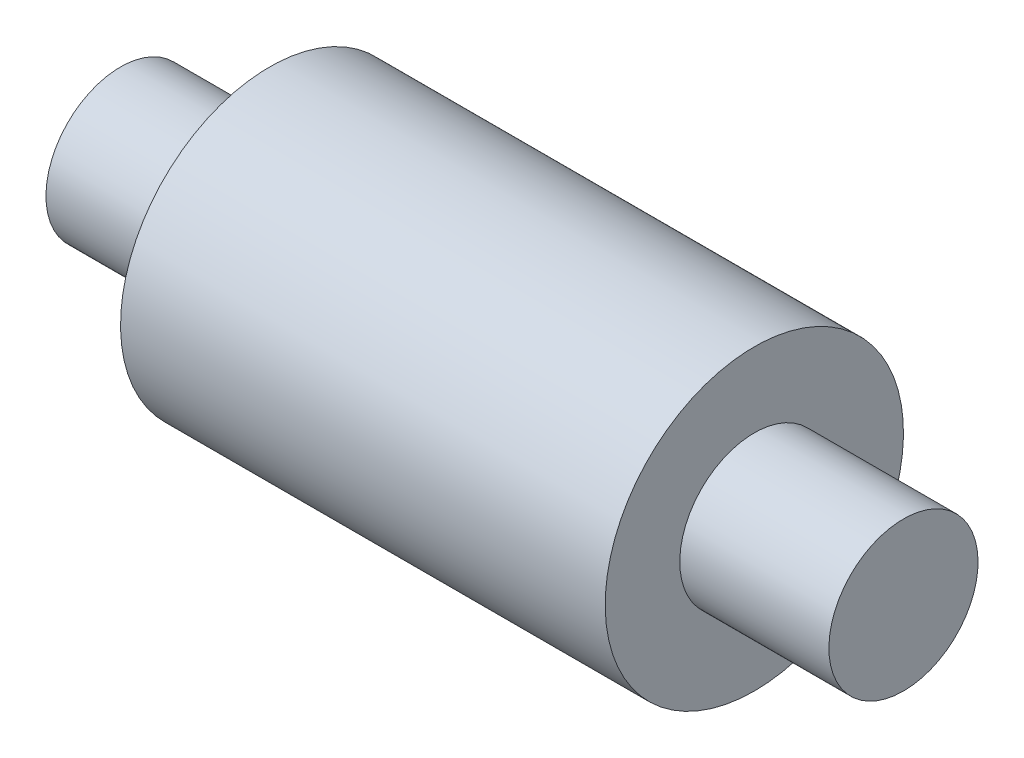
ISO-10303-21;
HEADER;
FILE_DESCRIPTION(('STEP AP214'),'2;1');
FILE_NAME('part.step','',(''),(''),'','','');
FILE_SCHEMA(('AUTOMOTIVE_DESIGN { 1 0 10303 214 1 1 1 1 }'));
ENDSEC;
DATA;
#1=APPLICATION_CONTEXT('core data for automotive mechanical design processes');
#2=APPLICATION_PROTOCOL_DEFINITION('international standard','automotive_design',2000,#1);
#3=PRODUCT_CONTEXT('',#1,'mechanical');
#4=PRODUCT('Part','Part','',(#3));
#5=PRODUCT_RELATED_PRODUCT_CATEGORY('part','',(#4));
#6=PRODUCT_DEFINITION_FORMATION('','',#4);
#7=PRODUCT_DEFINITION_CONTEXT('part definition',#1,'design');
#8=PRODUCT_DEFINITION('design','',#6,#7);
#9=PRODUCT_DEFINITION_SHAPE('','',#8);
#10=(LENGTH_UNIT() NAMED_UNIT(*) SI_UNIT(.MILLI.,.METRE.));
#11=(NAMED_UNIT(*) PLANE_ANGLE_UNIT() SI_UNIT($,.RADIAN.));
#12=(NAMED_UNIT(*) SI_UNIT($,.STERADIAN.) SOLID_ANGLE_UNIT());
#13=UNCERTAINTY_MEASURE_WITH_UNIT(LENGTH_MEASURE(1.E-05),#10,'distance_accuracy_value','');
#14=(GEOMETRIC_REPRESENTATION_CONTEXT(3) GLOBAL_UNCERTAINTY_ASSIGNED_CONTEXT((#13)) GLOBAL_UNIT_ASSIGNED_CONTEXT((#10,
#11,#12)) REPRESENTATION_CONTEXT('',''));
#15=CARTESIAN_POINT('',(0.,0.,0.));
#16=DIRECTION('',(0.,0.,1.));
#17=DIRECTION('',(1.,0.,0.));
#18=AXIS2_PLACEMENT_3D('',#15,#16,#17);
#19=CARTESIAN_POINT('',(21.,0.,0.));
#20=DIRECTION('',(1.,0.,0.));
#21=DIRECTION('',(0.,1.,0.));
#22=AXIS2_PLACEMENT_3D('',#19,#20,#21);
#23=PLANE('',#22);
#24=CARTESIAN_POINT('',(21.,0.,0.));
#25=DIRECTION('',(-1.,0.,0.));
#26=DIRECTION('',(0.,-1.,0.));
#27=AXIS2_PLACEMENT_3D('',#24,#25,#26);
#28=CIRCLE('',#27,2.);
#29=CARTESIAN_POINT('',(21.,-2.,0.));
#30=VERTEX_POINT('',#29);
#31=EDGE_CURVE('E13',#30,#30,#28,.T.);
#32=ORIENTED_EDGE('',*,*,#31,.F.);
#33=EDGE_LOOP('',(#32));
#34=FACE_BOUND('',#33,.T.);
#35=ADVANCED_FACE('F57',(#34),#23,.T.);
#36=CARTESIAN_POINT('',(-16.7017543859649,0.,0.));
#37=DIRECTION('',(-1.,0.,0.));
#38=DIRECTION('',(0.,-1.,0.));
#39=AXIS2_PLACEMENT_3D('',#36,#37,#38);
#40=CYLINDRICAL_SURFACE('',#39,2.);
#41=ORIENTED_EDGE('',*,*,#31,.T.);
#42=EDGE_LOOP('',(#41));
#43=FACE_BOUND('',#42,.T.);
#44=CARTESIAN_POINT('',(17.,0.,0.));
#45=DIRECTION('',(-1.,0.,0.));
#46=DIRECTION('',(0.,-1.,0.));
#47=AXIS2_PLACEMENT_3D('',#44,#45,#46);
#48=CIRCLE('',#47,2.);
#49=CARTESIAN_POINT('',(17.,-2.,0.));
#50=VERTEX_POINT('',#49);
#51=EDGE_CURVE('E69',#50,#50,#48,.T.);
#52=ORIENTED_EDGE('',*,*,#51,.F.);
#53=EDGE_LOOP('',(#52));
#54=FACE_BOUND('',#53,.T.);
#55=ADVANCED_FACE('F127',(#43,#54),#40,.T.);
#56=CARTESIAN_POINT('',(17.,0.,0.));
#57=DIRECTION('',(1.,0.,0.));
#58=DIRECTION('',(0.,1.,0.));
#59=AXIS2_PLACEMENT_3D('',#56,#57,#58);
#60=PLANE('',#59);
#61=ORIENTED_EDGE('',*,*,#51,.T.);
#62=EDGE_LOOP('',(#61));
#63=FACE_BOUND('',#62,.T.);
#64=CARTESIAN_POINT('',(17.,0.,0.));
#65=DIRECTION('',(-1.,0.,0.));
#66=DIRECTION('',(0.,-1.,0.));
#67=AXIS2_PLACEMENT_3D('',#64,#65,#66);
#68=CIRCLE('',#67,4.);
#69=CARTESIAN_POINT('',(17.,-4.,0.));
#70=VERTEX_POINT('',#69);
#71=EDGE_CURVE('E73',#70,#70,#68,.T.);
#72=ORIENTED_EDGE('',*,*,#71,.F.);
#73=EDGE_LOOP('',(#72));
#74=FACE_BOUND('',#73,.T.);
#75=ADVANCED_FACE('F100',(#63,#74),#60,.T.);
#76=CARTESIAN_POINT('',(-16.7017543859649,0.,0.));
#77=DIRECTION('',(-1.,0.,0.));
#78=DIRECTION('',(0.,-1.,0.));
#79=AXIS2_PLACEMENT_3D('',#76,#77,#78);
#80=CYLINDRICAL_SURFACE('',#79,4.);
#81=CARTESIAN_POINT('',(11.5,-4.,0.));
#82=CARTESIAN_POINT('',(11.4999984495079,-3.99999906578675,0.0552507257798208));
#83=CARTESIAN_POINT('',(11.4954056328175,-3.99884385421219,0.110518771887176));
#84=CARTESIAN_POINT('',(11.477183232462,-3.99434742553261,0.219470882513688));
#85=CARTESIAN_POINT('',(11.4635485269748,-3.99100496946646,0.273154031247159));
#86=CARTESIAN_POINT('',(11.4277071643586,-3.98250417554693,0.377347248121718));
#87=CARTESIAN_POINT('',(11.4055108008565,-3.97734801894725,0.42786104228667));
#88=CARTESIAN_POINT('',(11.3532124066368,-3.96576895871729,0.524448087936285));
#89=CARTESIAN_POINT('',(11.323110109254,-3.95934601236034,0.57052118956584));
#90=CARTESIAN_POINT('',(11.2551994735639,-3.94578275727868,0.657867951533947));
#91=CARTESIAN_POINT('',(11.2172589500272,-3.93863138099022,0.699037126707382));
#92=CARTESIAN_POINT('',(11.1350318633941,-3.92449080078353,0.774499284802204));
#93=CARTESIAN_POINT('',(11.0907445847023,-3.91750161525566,0.808791491299424));
#94=CARTESIAN_POINT('',(10.9962698488417,-3.9043651713314,0.870017695199356));
#95=CARTESIAN_POINT('',(10.9460045127931,-3.89823196313737,0.896834810616906));
#96=CARTESIAN_POINT('',(10.8415010588944,-3.88766329874815,0.941597939033686));
#97=CARTESIAN_POINT('',(10.7872635777828,-3.88322757115192,0.95954537029289));
#98=CARTESIAN_POINT('',(10.6775043345317,-3.87666984478367,0.985703224536195));
#99=CARTESIAN_POINT('',(10.6220300693001,-3.87450327383617,0.994101512222227));
#100=CARTESIAN_POINT('',(10.5104209539907,-3.8725957502516,1.00150785004524));
#101=CARTESIAN_POINT('',(10.4542862128676,-3.87285440299096,1.00051742787865));
#102=CARTESIAN_POINT('',(10.3443894615037,-3.87572803664412,0.989324349759522));
#103=CARTESIAN_POINT('',(10.2906029190233,-3.87828575334586,0.979345560127015));
#104=CARTESIAN_POINT('',(10.1854926327258,-3.88537806450989,0.950816124602073));
#105=CARTESIAN_POINT('',(10.1341690646473,-3.88991279980464,0.932264868046284));
#106=CARTESIAN_POINT('',(10.0348413224986,-3.90050075936124,0.886926318624771));
#107=CARTESIAN_POINT('',(9.98687588547363,-3.90656884979614,0.860057778155275));
#108=CARTESIAN_POINT('',(9.89605419349544,-3.91953140564257,0.79890418400997));
#109=CARTESIAN_POINT('',(9.85319883462183,-3.9264260155649,0.764617832539227));
#110=CARTESIAN_POINT('',(9.7725309228704,-3.94050587026521,0.688442283120812));
#111=CARTESIAN_POINT('',(9.73489700662576,-3.94769379651981,0.646364172110574));
#112=CARTESIAN_POINT('',(9.6671858383574,-3.96137310385857,0.556407945002467));
#113=CARTESIAN_POINT('',(9.63710881715762,-3.96786446366277,0.508529651805297));
#114=CARTESIAN_POINT('',(9.58529960918374,-3.97945154729455,0.408077259120929));
#115=CARTESIAN_POINT('',(9.56359643983038,-3.9845424008515,0.355487595472417));
#116=CARTESIAN_POINT('',(9.52938846286028,-3.99271944660946,0.247250672095256));
#117=CARTESIAN_POINT('',(9.51688189572124,-3.99580602226187,0.191603999433657));
#118=CARTESIAN_POINT('',(9.50169495629411,-3.9995699951425,0.0803599802600184));
#119=CARTESIAN_POINT('',(9.4987713159498,-4.00030702338852,0.0247978133254736));
#120=CARTESIAN_POINT('',(9.50216600137032,-3.999458698763,-0.0860219165343387));
#121=CARTESIAN_POINT('',(9.50848349519942,-3.99787355494564,-0.14127950642973));
#122=CARTESIAN_POINT('',(9.52998060559425,-3.99259720751571,-0.249076179184328));
#123=CARTESIAN_POINT('',(9.54502750898466,-3.98893756123874,-0.301643412645837));
#124=CARTESIAN_POINT('',(9.58340472268563,-3.97992471089423,-0.403504861635008));
#125=CARTESIAN_POINT('',(9.60673586954211,-3.97457133579928,-0.452798746021757));
#126=CARTESIAN_POINT('',(9.66149075258315,-3.96262205284207,-0.547682089619899));
#127=CARTESIAN_POINT('',(9.69305074159784,-3.95600578244621,-0.593190294557222));
#128=CARTESIAN_POINT('',(9.76319327253131,-3.94229672791613,-0.678351075762166));
#129=CARTESIAN_POINT('',(9.80177702641127,-3.93520386167803,-0.71800263931534));
#130=CARTESIAN_POINT('',(9.88600130722964,-3.92112637973847,-0.791327045381821));
#131=CARTESIAN_POINT('',(9.93179180200161,-3.91414869458187,-0.824829245081356));
#132=CARTESIAN_POINT('',(10.0284884229771,-3.90128585584826,-0.8836738393418));
#133=CARTESIAN_POINT('',(10.0793943219732,-3.89540065378017,-0.909016596105292));
#134=CARTESIAN_POINT('',(10.1846038149421,-3.88545396489777,-0.950634280406196));
#135=CARTESIAN_POINT('',(10.2388850855627,-3.88138170194604,-0.966962931102711));
#136=CARTESIAN_POINT('',(10.3495397585927,-3.87551162726789,-0.990230439969187));
#137=CARTESIAN_POINT('',(10.4059127006883,-3.87371331813291,-0.99717135165244));
#138=CARTESIAN_POINT('',(10.5174140159035,-3.87263267469304,-1.00135906022266));
#139=CARTESIAN_POINT('',(10.5725316234165,-3.87327955152176,-0.99887859852008));
#140=CARTESIAN_POINT('',(10.6815359257787,-3.87685272671895,-0.984918185541913));
#141=CARTESIAN_POINT('',(10.7354226453424,-3.87977897927904,-0.973438415124514));
#142=CARTESIAN_POINT('',(10.8401389727103,-3.88754173788482,-0.941954212961864));
#143=CARTESIAN_POINT('',(10.8909848701601,-3.89236676824206,-0.922000936453585));
#144=CARTESIAN_POINT('',(10.9886435884758,-3.90338503816552,-0.874176609070048));
#145=CARTESIAN_POINT('',(11.0354558487913,-3.90957846747182,-0.846304460022794));
#146=CARTESIAN_POINT('',(11.1250364193347,-3.92283756175675,-0.782578499091425));
#147=CARTESIAN_POINT('',(11.1676673822826,-3.92992176554505,-0.746535441941504));
#148=CARTESIAN_POINT('',(11.2463646965303,-3.94405351497524,-0.667859580793158));
#149=CARTESIAN_POINT('',(11.282429486742,-3.95110105151373,-0.625225214174098));
#150=CARTESIAN_POINT('',(11.3476075390431,-3.96451770431775,-0.533645057801728));
#151=CARTESIAN_POINT('',(11.3765830757811,-3.97087222243912,-0.484598948210926));
#152=CARTESIAN_POINT('',(11.4258316419604,-3.98203283316746,-0.382177373006985));
#153=CARTESIAN_POINT('',(11.446110907099,-3.98684003466521,-0.328805042291161));
#154=CARTESIAN_POINT('',(11.4743812202198,-3.99365373043694,-0.229606835495649));
#155=CARTESIAN_POINT('',(11.483967495369,-3.9960172336846,-0.184253447272047));
#156=CARTESIAN_POINT('',(11.496777295748,-3.99919070154632,-0.092604047690856));
#157=CARTESIAN_POINT('',(11.5000012995369,-4.00000078300596,-0.0463081074950778));
#158=CARTESIAN_POINT('',(11.5,-4.,0.));
#159=B_SPLINE_CURVE_WITH_KNOTS('',3,(#81,#82,#83,#84,#85,#86,#87,#88,#89,#90,#91,#92,#93,#94,
#95,#96,#97,#98,#99,#100,#101,#102,#103,#104,#105,#106,#107,#108,#109,#110,#111,#112,#113,#114,
#115,#116,#117,#118,#119,#120,#121,#122,#123,#124,#125,#126,#127,#128,#129,#130,#131,#132,#133,
#134,#135,#136,#137,#138,#139,#140,#141,#142,#143,#144,#145,#146,#147,#148,#149,#150,#151,#152,
#153,#154,#155,#156,#157,#158),.UNSPECIFIED.,.T.,.F.,(4,2,2,2,2,2,2,2,2,2,2,2,2,2,2,2,2,2,2,2,2,
2,2,2,2,2,2,2,2,2,2,2,2,2,2,2,2,2,4),(0.,0.16558247498126,0.331258825175933,0.496736601524071,
0.662219960112886,0.830762902914261,0.999324863867081,1.17039098363871,1.34142974112912,
1.50904196732954,1.67662692075131,1.84014998004679,2.00368468977359,2.16887018582586,
2.33408460557442,2.50401000646013,2.67394059705498,2.84445486006076,3.01493649125762,
3.18105539299518,3.34715934075162,3.51080183009359,3.67446084881527,3.84102391710235,
4.0076157533868,4.17829672802984,4.34897012499673,4.51861503076025,4.68822282168272,
4.85295853599076,5.0176909397069,5.18144267039632,5.34521712091268,5.51326384273274,
5.68135046513613,5.85248123666393,6.02348909214234,6.16228161961434,6.30106370695361),.UNSPECIFIED.);
#160=CARTESIAN_POINT('',(11.5,-4.,0.));
#161=VERTEX_POINT('',#160);
#162=EDGE_CURVE('E60',#161,#161,#159,.T.);
#163=ORIENTED_EDGE('',*,*,#162,.F.);
#164=EDGE_LOOP('',(#163));
#165=FACE_BOUND('',#164,.T.);
#166=ORIENTED_EDGE('',*,*,#71,.T.);
#167=EDGE_LOOP('',(#166));
#168=FACE_BOUND('',#167,.T.);
#169=CARTESIAN_POINT('',(4.,0.,0.));
#170=DIRECTION('',(-1.,0.,0.));
#171=DIRECTION('',(0.,-1.,0.));
#172=AXIS2_PLACEMENT_3D('',#169,#170,#171);
#173=CIRCLE('',#172,4.);
#174=CARTESIAN_POINT('',(4.,-4.,0.));
#175=VERTEX_POINT('',#174);
#176=EDGE_CURVE('E78',#175,#175,#173,.T.);
#177=ORIENTED_EDGE('',*,*,#176,.F.);
#178=EDGE_LOOP('',(#177));
#179=FACE_BOUND('',#178,.T.);
#180=ADVANCED_FACE('F96',(#165,#168,#179),#80,.T.);
#181=CARTESIAN_POINT('',(4.,0.,0.));
#182=DIRECTION('',(-1.,0.,0.));
#183=DIRECTION('',(0.,-1.,0.));
#184=AXIS2_PLACEMENT_3D('',#181,#182,#183);
#185=PLANE('',#184);
#186=ORIENTED_EDGE('',*,*,#176,.T.);
#187=EDGE_LOOP('',(#186));
#188=FACE_BOUND('',#187,.T.);
#189=CARTESIAN_POINT('',(4.,0.,0.));
#190=DIRECTION('',(-1.,0.,0.));
#191=DIRECTION('',(0.,-1.,0.));
#192=AXIS2_PLACEMENT_3D('',#189,#190,#191);
#193=CIRCLE('',#192,2.);
#194=CARTESIAN_POINT('',(4.,-2.,0.));
#195=VERTEX_POINT('',#194);
#196=EDGE_CURVE('E81',#195,#195,#193,.T.);
#197=ORIENTED_EDGE('',*,*,#196,.F.);
#198=EDGE_LOOP('',(#197));
#199=FACE_BOUND('',#198,.T.);
#200=ADVANCED_FACE('F99',(#188,#199),#185,.T.);
#201=CARTESIAN_POINT('',(-16.7017543859649,0.,0.));
#202=DIRECTION('',(-1.,0.,0.));
#203=DIRECTION('',(0.,-1.,0.));
#204=AXIS2_PLACEMENT_3D('',#201,#202,#203);
#205=CYLINDRICAL_SURFACE('',#204,2.);
#206=ORIENTED_EDGE('',*,*,#196,.T.);
#207=EDGE_LOOP('',(#206));
#208=FACE_BOUND('',#207,.T.);
#209=CARTESIAN_POINT('',(0.,0.,0.));
#210=DIRECTION('',(-1.,0.,0.));
#211=DIRECTION('',(0.,-1.,0.));
#212=AXIS2_PLACEMENT_3D('',#209,#210,#211);
#213=CIRCLE('',#212,2.);
#214=CARTESIAN_POINT('',(0.,-2.,0.));
#215=VERTEX_POINT('',#214);
#216=EDGE_CURVE('E84',#215,#215,#213,.T.);
#217=ORIENTED_EDGE('',*,*,#216,.F.);
#218=EDGE_LOOP('',(#217));
#219=FACE_BOUND('',#218,.T.);
#220=ADVANCED_FACE('F107',(#208,#219),#205,.T.);
#221=CARTESIAN_POINT('',(0.,0.,0.));
#222=DIRECTION('',(-1.,0.,0.));
#223=DIRECTION('',(0.,-1.,0.));
#224=AXIS2_PLACEMENT_3D('',#221,#222,#223);
#225=PLANE('',#224);
#226=ORIENTED_EDGE('',*,*,#216,.T.);
#227=EDGE_LOOP('',(#226));
#228=FACE_BOUND('',#227,.T.);
#229=ADVANCED_FACE('F113',(#228),#225,.T.);
#230=CARTESIAN_POINT('',(10.5,-30.,0.));
#231=DIRECTION('',(0.,1.,0.));
#232=DIRECTION('',(0.,0.,1.));
#233=AXIS2_PLACEMENT_3D('',#230,#231,#232);
#234=CYLINDRICAL_SURFACE('',#233,1.);
#235=ORIENTED_EDGE('',*,*,#162,.T.);
#236=EDGE_LOOP('',(#235));
#237=FACE_BOUND('',#236,.T.);
#238=CARTESIAN_POINT('',(10.5,0.,0.));
#239=DIRECTION('',(0.,1.,0.));
#240=DIRECTION('',(0.,0.,1.));
#241=AXIS2_PLACEMENT_3D('',#238,#239,#240);
#242=CIRCLE('',#241,1.);
#243=CARTESIAN_POINT('',(10.5,0.,1.));
#244=VERTEX_POINT('',#243);
#245=EDGE_CURVE('E87',#244,#244,#242,.T.);
#246=ORIENTED_EDGE('',*,*,#245,.T.);
#247=EDGE_LOOP('',(#246));
#248=FACE_BOUND('',#247,.T.);
#249=ADVANCED_FACE('F94',(#237,#248),#234,.F.);
#250=CARTESIAN_POINT('',(0.,0.,0.));
#251=DIRECTION('',(0.,1.,0.));
#252=DIRECTION('',(0.,0.,1.));
#253=AXIS2_PLACEMENT_3D('',#250,#251,#252);
#254=PLANE('',#253);
#255=ORIENTED_EDGE('',*,*,#245,.F.);
#256=EDGE_LOOP('',(#255));
#257=FACE_BOUND('',#256,.T.);
#258=ADVANCED_FACE('F119',(#257),#254,.F.);
#259=CLOSED_SHELL('',(#35,#55,#75,#180,#200,#220,#229,#249,#258));
#260=MANIFOLD_SOLID_BREP('B2',#259);
#261=ADVANCED_BREP_SHAPE_REPRESENTATION('',(#18,#260),#14);
#262=SHAPE_DEFINITION_REPRESENTATION(#9,#261);
ENDSEC;
END-ISO-10303-21;
